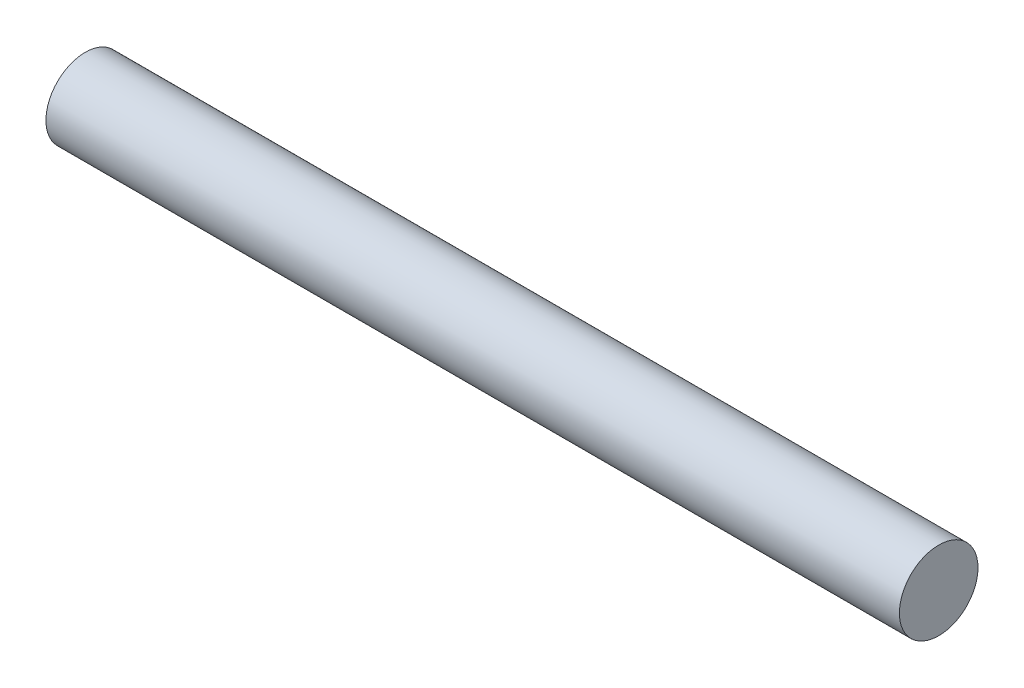
ISO-10303-21;
HEADER;
FILE_DESCRIPTION(('STEP AP214'),'2;1');
FILE_NAME('part.step','',(''),(''),'','','');
FILE_SCHEMA(('AUTOMOTIVE_DESIGN { 1 0 10303 214 1 1 1 1 }'));
ENDSEC;
DATA;
#1=APPLICATION_CONTEXT('core data for automotive mechanical design processes');
#2=APPLICATION_PROTOCOL_DEFINITION('international standard','automotive_design',2000,#1);
#3=PRODUCT_CONTEXT('',#1,'mechanical');
#4=PRODUCT('Part','Part','',(#3));
#5=PRODUCT_RELATED_PRODUCT_CATEGORY('part','',(#4));
#6=PRODUCT_DEFINITION_FORMATION('','',#4);
#7=PRODUCT_DEFINITION_CONTEXT('part definition',#1,'design');
#8=PRODUCT_DEFINITION('design','',#6,#7);
#9=PRODUCT_DEFINITION_SHAPE('','',#8);
#10=(LENGTH_UNIT() NAMED_UNIT(*) SI_UNIT(.MILLI.,.METRE.));
#11=(NAMED_UNIT(*) PLANE_ANGLE_UNIT() SI_UNIT($,.RADIAN.));
#12=(NAMED_UNIT(*) SI_UNIT($,.STERADIAN.) SOLID_ANGLE_UNIT());
#13=UNCERTAINTY_MEASURE_WITH_UNIT(LENGTH_MEASURE(1.E-05),#10,'distance_accuracy_value','');
#14=(GEOMETRIC_REPRESENTATION_CONTEXT(3) GLOBAL_UNCERTAINTY_ASSIGNED_CONTEXT((#13)) GLOBAL_UNIT_ASSIGNED_CONTEXT((#10,
#11,#12)) REPRESENTATION_CONTEXT('',''));
#15=CARTESIAN_POINT('',(0.,0.,0.));
#16=DIRECTION('',(0.,0.,1.));
#17=DIRECTION('',(1.,0.,0.));
#18=AXIS2_PLACEMENT_3D('',#15,#16,#17);
#19=CARTESIAN_POINT('',(0.,0.,0.));
#20=DIRECTION('',(1.,0.,0.));
#21=DIRECTION('',(0.,0.,-1.));
#22=AXIS2_PLACEMENT_3D('',#19,#20,#21);
#23=PLANE('',#22);
#24=CARTESIAN_POINT('',(0.,0.,0.));
#25=DIRECTION('',(1.,0.,0.));
#26=DIRECTION('',(0.,0.,-1.));
#27=AXIS2_PLACEMENT_3D('',#24,#25,#26);
#28=CIRCLE('',#27,8.75);
#29=CARTESIAN_POINT('',(0.,0.,-8.75));
#30=VERTEX_POINT('',#29);
#31=EDGE_CURVE('E39',#30,#30,#28,.T.);
#32=ORIENTED_EDGE('',*,*,#31,.F.);
#33=EDGE_LOOP('',(#32));
#34=FACE_BOUND('',#33,.T.);
#35=ADVANCED_FACE('F32',(#34),#23,.F.);
#36=CARTESIAN_POINT('',(190.,0.,0.));
#37=DIRECTION('',(1.,0.,0.));
#38=DIRECTION('',(0.,0.,-1.));
#39=AXIS2_PLACEMENT_3D('',#36,#37,#38);
#40=PLANE('',#39);
#41=CARTESIAN_POINT('',(190.,0.,0.));
#42=DIRECTION('',(1.,0.,0.));
#43=DIRECTION('',(0.,0.,-1.));
#44=AXIS2_PLACEMENT_3D('',#41,#42,#43);
#45=CIRCLE('',#44,8.75);
#46=CARTESIAN_POINT('',(190.,0.,-8.75));
#47=VERTEX_POINT('',#46);
#48=EDGE_CURVE('E11',#47,#47,#45,.T.);
#49=ORIENTED_EDGE('',*,*,#48,.T.);
#50=EDGE_LOOP('',(#49));
#51=FACE_BOUND('',#50,.T.);
#52=ADVANCED_FACE('F46',(#51),#40,.T.);
#53=CARTESIAN_POINT('',(0.,0.,0.));
#54=DIRECTION('',(1.,0.,0.));
#55=DIRECTION('',(0.,0.,-1.));
#56=AXIS2_PLACEMENT_3D('',#53,#54,#55);
#57=CYLINDRICAL_SURFACE('',#56,8.75);
#58=ORIENTED_EDGE('',*,*,#48,.F.);
#59=EDGE_LOOP('',(#58));
#60=FACE_BOUND('',#59,.T.);
#61=ORIENTED_EDGE('',*,*,#31,.T.);
#62=EDGE_LOOP('',(#61));
#63=FACE_BOUND('',#62,.T.);
#64=ADVANCED_FACE('F48',(#60,#63),#57,.T.);
#65=CLOSED_SHELL('',(#35,#52,#64));
#66=MANIFOLD_SOLID_BREP('B2',#65);
#67=ADVANCED_BREP_SHAPE_REPRESENTATION('',(#18,#66),#14);
#68=SHAPE_DEFINITION_REPRESENTATION(#9,#67);
ENDSEC;
END-ISO-10303-21;
